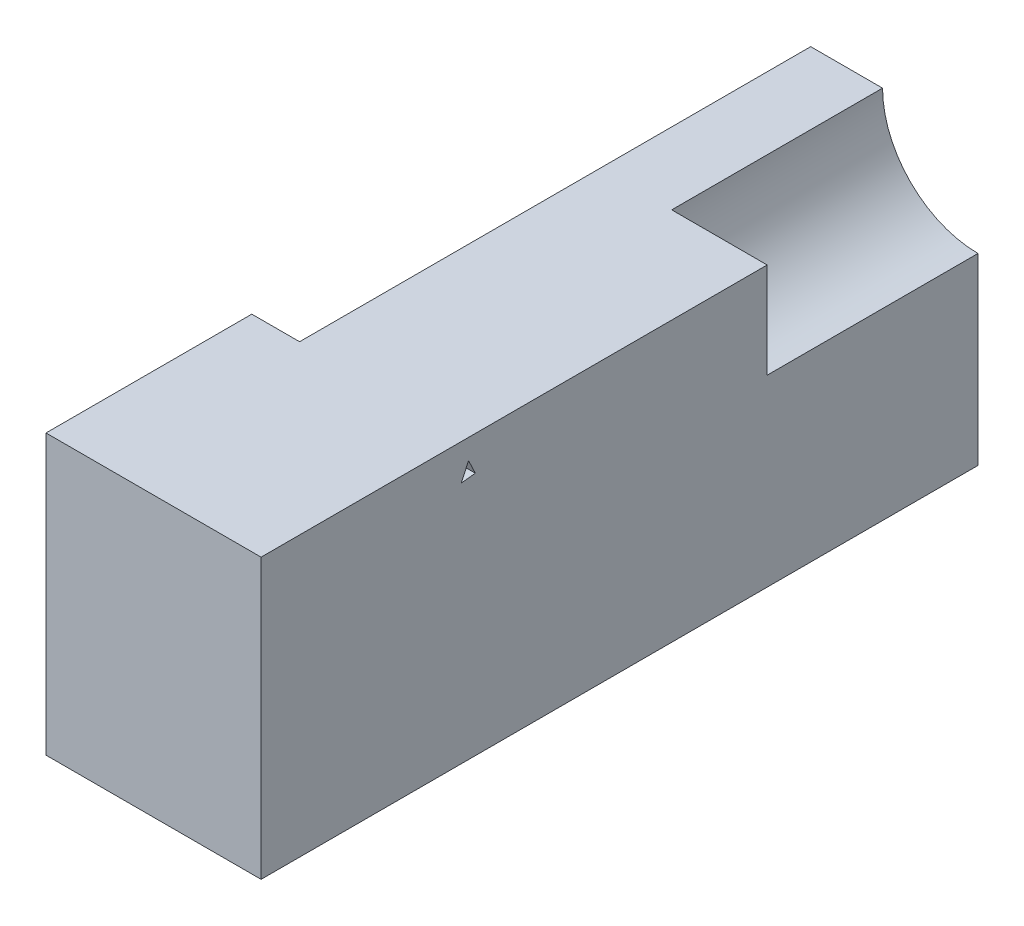
ISO-10303-21;
HEADER;
FILE_DESCRIPTION(('STEP AP214'),'2;1');
FILE_NAME('part.step','',(''),(''),'','','');
FILE_SCHEMA(('AUTOMOTIVE_DESIGN { 1 0 10303 214 1 1 1 1 }'));
ENDSEC;
DATA;
#1=APPLICATION_CONTEXT('core data for automotive mechanical design processes');
#2=APPLICATION_PROTOCOL_DEFINITION('international standard','automotive_design',2000,#1);
#3=PRODUCT_CONTEXT('',#1,'mechanical');
#4=PRODUCT('Part','Part','',(#3));
#5=PRODUCT_RELATED_PRODUCT_CATEGORY('part','',(#4));
#6=PRODUCT_DEFINITION_FORMATION('','',#4);
#7=PRODUCT_DEFINITION_CONTEXT('part definition',#1,'design');
#8=PRODUCT_DEFINITION('design','',#6,#7);
#9=PRODUCT_DEFINITION_SHAPE('','',#8);
#10=(LENGTH_UNIT() NAMED_UNIT(*) SI_UNIT(.MILLI.,.METRE.));
#11=(NAMED_UNIT(*) PLANE_ANGLE_UNIT() SI_UNIT($,.RADIAN.));
#12=(NAMED_UNIT(*) SI_UNIT($,.STERADIAN.) SOLID_ANGLE_UNIT());
#13=UNCERTAINTY_MEASURE_WITH_UNIT(LENGTH_MEASURE(1.E-05),#10,'distance_accuracy_value','');
#14=(GEOMETRIC_REPRESENTATION_CONTEXT(3) GLOBAL_UNCERTAINTY_ASSIGNED_CONTEXT((#13)) GLOBAL_UNIT_ASSIGNED_CONTEXT((#10,
#11,#12)) REPRESENTATION_CONTEXT('',''));
#15=CARTESIAN_POINT('',(0.,0.,0.));
#16=DIRECTION('',(0.,0.,1.));
#17=DIRECTION('',(1.,0.,0.));
#18=AXIS2_PLACEMENT_3D('',#15,#16,#17);
#19=CARTESIAN_POINT('',(0.,0.,0.));
#20=DIRECTION('',(1.,0.,0.));
#21=DIRECTION('',(0.,1.,0.));
#22=AXIS2_PLACEMENT_3D('',#19,#20,#21);
#23=PLANE('',#22);
#24=DIRECTION('',(0.,1.,0.));
#25=VECTOR('',#24,1.);
#26=CARTESIAN_POINT('',(0.,0.,79.892292740171));
#27=LINE('',#26,#25);
#28=CARTESIAN_POINT('',(0.,0.,79.892292740171));
#29=VERTEX_POINT('',#28);
#30=CARTESIAN_POINT('',(0.,31.098184685144,79.892292740171));
#31=VERTEX_POINT('',#30);
#32=EDGE_CURVE('E43',#29,#31,#27,.T.);
#33=ORIENTED_EDGE('',*,*,#32,.T.);
#34=DIRECTION('',(0.,0.,1.));
#35=VECTOR('',#34,1.);
#36=CARTESIAN_POINT('',(0.,31.098184685144,0.));
#37=LINE('',#36,#35);
#38=CARTESIAN_POINT('',(0.,31.098184685144,56.957119213043));
#39=VERTEX_POINT('',#38);
#40=EDGE_CURVE('E196',#39,#31,#37,.T.);
#41=ORIENTED_EDGE('',*,*,#40,.F.);
#42=DIRECTION('',(0.,1.,0.));
#43=VECTOR('',#42,1.);
#44=CARTESIAN_POINT('',(0.,0.,56.957119213043));
#45=LINE('',#44,#43);
#46=CARTESIAN_POINT('',(0.,28.454084183337,56.957119213043));
#47=VERTEX_POINT('',#46);
#48=EDGE_CURVE('E197',#47,#39,#45,.T.);
#49=ORIENTED_EDGE('',*,*,#48,.F.);
#50=DIRECTION('',(0.,-0.907754917884879,0.419500904713944));
#51=VECTOR('',#50,1.);
#52=CARTESIAN_POINT('',(0.,27.775449609147,57.270736701898));
#53=LINE('',#52,#51);
#54=CARTESIAN_POINT('',(0.,27.090633965193,57.587210649372));
#55=VERTEX_POINT('',#54);
#56=EDGE_CURVE('E304',#47,#55,#53,.T.);
#57=ORIENTED_EDGE('',*,*,#56,.T.);
#58=DIRECTION('',(0.,0.110317625824,-0.993896383650004));
#59=VECTOR('',#58,1.);
#60=CARTESIAN_POINT('',(0.,30.082842141755,30.629189539079));
#61=LINE('',#60,#59);
#62=CARTESIAN_POINT('',(0.,27.160571025485,56.957119213043));
#63=VERTEX_POINT('',#62);
#64=EDGE_CURVE('E305',#55,#63,#61,.T.);
#65=ORIENTED_EDGE('',*,*,#64,.T.);
#66=DIRECTION('',(0.,1.,0.));
#67=VECTOR('',#66,1.);
#68=CARTESIAN_POINT('',(0.,0.,56.957119213043));
#69=LINE('',#68,#67);
#70=CARTESIAN_POINT('',(0.,0.,56.957119213043));
#71=VERTEX_POINT('',#70);
#72=EDGE_CURVE('E224',#71,#63,#69,.T.);
#73=ORIENTED_EDGE('',*,*,#72,.F.);
#74=DIRECTION('',(0.,0.,1.));
#75=VECTOR('',#74,1.);
#76=CARTESIAN_POINT('',(0.,0.,0.));
#77=LINE('',#76,#75);
#78=EDGE_CURVE('E10',#71,#29,#77,.T.);
#79=ORIENTED_EDGE('',*,*,#78,.T.);
#80=EDGE_LOOP('',(#33,#41,#49,#57,#65,#73,#79));
#81=FACE_BOUND('',#80,.T.);
#82=ADVANCED_FACE('F16',(#81),#23,.F.);
#83=CARTESIAN_POINT('',(0.,0.,0.));
#84=DIRECTION('',(0.,1.,0.));
#85=DIRECTION('',(1.,0.,0.));
#86=AXIS2_PLACEMENT_3D('',#83,#84,#85);
#87=PLANE('',#86);
#88=DIRECTION('',(0.,0.,1.));
#89=VECTOR('',#88,1.);
#90=CARTESIAN_POINT('',(23.97055786755,0.,0.));
#91=LINE('',#90,#89);
#92=CARTESIAN_POINT('',(23.97055786755,0.,0.));
#93=VERTEX_POINT('',#92);
#94=CARTESIAN_POINT('',(23.97055786755,0.,79.892292740171));
#95=VERTEX_POINT('',#94);
#96=EDGE_CURVE('E281',#93,#95,#91,.T.);
#97=ORIENTED_EDGE('',*,*,#96,.T.);
#98=DIRECTION('',(1.,0.,0.));
#99=VECTOR('',#98,1.);
#100=CARTESIAN_POINT('',(0.,0.,79.892292740171));
#101=LINE('',#100,#99);
#102=EDGE_CURVE('E24',#29,#95,#101,.T.);
#103=ORIENTED_EDGE('',*,*,#102,.F.);
#104=ORIENTED_EDGE('',*,*,#78,.F.);
#105=DIRECTION('',(-1.,0.,0.));
#106=VECTOR('',#105,1.);
#107=CARTESIAN_POINT('',(5.325498064003,0.,56.957119213043));
#108=LINE('',#107,#106);
#109=CARTESIAN_POINT('',(5.325498064003,0.,56.957119213043));
#110=VERTEX_POINT('',#109);
#111=EDGE_CURVE('E229',#110,#71,#108,.T.);
#112=ORIENTED_EDGE('',*,*,#111,.F.);
#113=DIRECTION('',(0.,0.,1.));
#114=VECTOR('',#113,1.);
#115=CARTESIAN_POINT('',(5.325498064003,0.,0.));
#116=LINE('',#115,#114);
#117=CARTESIAN_POINT('',(5.325498064003,0.,0.));
#118=VERTEX_POINT('',#117);
#119=EDGE_CURVE('E244',#118,#110,#116,.T.);
#120=ORIENTED_EDGE('',*,*,#119,.F.);
#121=DIRECTION('',(1.,0.,0.));
#122=VECTOR('',#121,1.);
#123=CARTESIAN_POINT('',(0.,0.,0.));
#124=LINE('',#123,#122);
#125=EDGE_CURVE('E210',#118,#93,#124,.T.);
#126=ORIENTED_EDGE('',*,*,#125,.T.);
#127=EDGE_LOOP('',(#97,#103,#104,#112,#120,#126));
#128=FACE_BOUND('',#127,.T.);
#129=ADVANCED_FACE('F613',(#128),#87,.F.);
#130=CARTESIAN_POINT('',(0.,0.,79.892292740171));
#131=DIRECTION('',(0.,0.,1.));
#132=DIRECTION('',(1.,0.,0.));
#133=AXIS2_PLACEMENT_3D('',#130,#131,#132);
#134=PLANE('',#133);
#135=ORIENTED_EDGE('',*,*,#32,.F.);
#136=ORIENTED_EDGE('',*,*,#102,.T.);
#137=DIRECTION('',(0.,1.,0.));
#138=VECTOR('',#137,1.);
#139=CARTESIAN_POINT('',(23.97055786755,0.,79.892292740171));
#140=LINE('',#139,#138);
#141=CARTESIAN_POINT('',(23.97055786755,31.098184685144,79.892292740171));
#142=VERTEX_POINT('',#141);
#143=EDGE_CURVE('E243',#95,#142,#140,.T.);
#144=ORIENTED_EDGE('',*,*,#143,.T.);
#145=DIRECTION('',(1.,0.,0.));
#146=VECTOR('',#145,1.);
#147=CARTESIAN_POINT('',(0.,31.098184685144,79.892292740171));
#148=LINE('',#147,#146);
#149=EDGE_CURVE('E319',#31,#142,#148,.T.);
#150=ORIENTED_EDGE('',*,*,#149,.F.);
#151=EDGE_LOOP('',(#135,#136,#144,#150));
#152=FACE_BOUND('',#151,.T.);
#153=ADVANCED_FACE('F608',(#152),#134,.T.);
#154=CARTESIAN_POINT('',(0.,31.098184685144,0.));
#155=DIRECTION('',(0.,1.,0.));
#156=DIRECTION('',(1.,0.,0.));
#157=AXIS2_PLACEMENT_3D('',#154,#155,#156);
#158=PLANE('',#157);
#159=DIRECTION('',(1.,0.,0.));
#160=VECTOR('',#159,1.);
#161=CARTESIAN_POINT('',(0.,31.098184685144,0.));
#162=LINE('',#161,#160);
#163=CARTESIAN_POINT('',(5.325498064003,31.098184685144,0.));
#164=VERTEX_POINT('',#163);
#165=CARTESIAN_POINT('',(13.333664042095,31.098184685144,0.));
#166=VERTEX_POINT('',#165);
#167=EDGE_CURVE('E213',#164,#166,#162,.T.);
#168=ORIENTED_EDGE('',*,*,#167,.F.);
#169=DIRECTION('',(0.,0.,1.));
#170=VECTOR('',#169,1.);
#171=CARTESIAN_POINT('',(5.325498064003,31.098184685144,0.));
#172=LINE('',#171,#170);
#173=CARTESIAN_POINT('',(5.325498064003,31.098184685144,56.957119213043));
#174=VERTEX_POINT('',#173);
#175=EDGE_CURVE('E220',#164,#174,#172,.T.);
#176=ORIENTED_EDGE('',*,*,#175,.T.);
#177=DIRECTION('',(1.,0.,0.));
#178=VECTOR('',#177,1.);
#179=CARTESIAN_POINT('',(0.,31.098184685144,56.957119213043));
#180=LINE('',#179,#178);
#181=EDGE_CURVE('E193',#39,#174,#180,.T.);
#182=ORIENTED_EDGE('',*,*,#181,.F.);
#183=ORIENTED_EDGE('',*,*,#40,.T.);
#184=ORIENTED_EDGE('',*,*,#149,.T.);
#185=DIRECTION('',(0.,0.,1.));
#186=VECTOR('',#185,1.);
#187=CARTESIAN_POINT('',(23.97055786755,31.098184685144,0.));
#188=LINE('',#187,#186);
#189=CARTESIAN_POINT('',(23.97055786755,31.098184685144,23.496480838702));
#190=VERTEX_POINT('',#189);
#191=EDGE_CURVE('E288',#190,#142,#188,.T.);
#192=ORIENTED_EDGE('',*,*,#191,.F.);
#193=DIRECTION('',(1.,0.,0.));
#194=VECTOR('',#193,1.);
#195=CARTESIAN_POINT('',(13.333664042095,31.098184685144,23.496480838702));
#196=LINE('',#195,#194);
#197=CARTESIAN_POINT('',(13.333664042095,31.098184685144,23.496480838702));
#198=VERTEX_POINT('',#197);
#199=EDGE_CURVE('E219',#198,#190,#196,.T.);
#200=ORIENTED_EDGE('',*,*,#199,.F.);
#201=DIRECTION('',(0.,0.,1.));
#202=VECTOR('',#201,1.);
#203=CARTESIAN_POINT('',(13.333664042095,31.098184685144,0.));
#204=LINE('',#203,#202);
#205=EDGE_CURVE('E263',#166,#198,#204,.T.);
#206=ORIENTED_EDGE('',*,*,#205,.F.);
#207=EDGE_LOOP('',(#168,#176,#182,#183,#184,#192,#200,#206));
#208=FACE_BOUND('',#207,.T.);
#209=ADVANCED_FACE('F612',(#208),#158,.T.);
#210=CARTESIAN_POINT('',(2.977349733661,15.549092342572,56.957119213043));
#211=DIRECTION('',(0.,0.,-1.));
#212=DIRECTION('',(0.,-1.,0.));
#213=AXIS2_PLACEMENT_3D('',#210,#211,#212);
#214=PLANE('',#213);
#215=DIRECTION('',(1.,0.,0.));
#216=VECTOR('',#215,1.);
#217=CARTESIAN_POINT('',(13.473953800606,28.454084183337,56.957119213043));
#218=LINE('',#217,#216);
#219=CARTESIAN_POINT('',(5.571616777536,28.454084183337,56.957119213043));
#220=VERTEX_POINT('',#219);
#221=EDGE_CURVE('E316',#47,#220,#218,.T.);
#222=ORIENTED_EDGE('',*,*,#221,.F.);
#223=ORIENTED_EDGE('',*,*,#48,.T.);
#224=ORIENTED_EDGE('',*,*,#181,.T.);
#225=DIRECTION('',(0.0926815638794323,-0.995695800793025,0.));
#226=VECTOR('',#225,1.);
#227=CARTESIAN_POINT('',(5.325498064003,31.098184685144,56.957119213043));
#228=LINE('',#227,#226);
#229=EDGE_CURVE('E235',#174,#220,#228,.T.);
#230=ORIENTED_EDGE('',*,*,#229,.T.);
#231=EDGE_LOOP('',(#222,#223,#224,#230));
#232=FACE_BOUND('',#231,.T.);
#233=ADVANCED_FACE('F653',(#232),#214,.T.);
#234=CARTESIAN_POINT('',(23.97055786755,28.854021416779,56.772296164495));
#235=DIRECTION('',(0.,0.419500904713944,0.907754917884879));
#236=DIRECTION('',(1.,0.,0.));
#237=AXIS2_PLACEMENT_3D('',#234,#235,#236);
#238=PLANE('',#237);
#239=DIRECTION('',(-1.,0.,0.));
#240=VECTOR('',#239,1.);
#241=CARTESIAN_POINT('',(23.97055786755,27.090633965193,57.587210649372));
#242=LINE('',#241,#240);
#243=CARTESIAN_POINT('',(23.97055786755,27.090633965193,57.587210649372));
#244=VERTEX_POINT('',#243);
#245=EDGE_CURVE('E300',#244,#55,#242,.T.);
#246=ORIENTED_EDGE('',*,*,#245,.T.);
#247=ORIENTED_EDGE('',*,*,#56,.F.);
#248=ORIENTED_EDGE('',*,*,#221,.T.);
#249=DIRECTION('',(0.0841958069571498,-0.904531688099997,0.418011353091999));
#250=VECTOR('',#249,1.);
#251=CARTESIAN_POINT('',(4.514495579591,39.81093978293,51.708773977038));
#252=LINE('',#251,#250);
#253=CARTESIAN_POINT('',(5.534389736687,28.854021416779,56.772296164495));
#254=VERTEX_POINT('',#253);
#255=EDGE_CURVE('E180',#254,#220,#252,.T.);
#256=ORIENTED_EDGE('',*,*,#255,.F.);
#257=DIRECTION('',(-1.,0.,0.));
#258=VECTOR('',#257,1.);
#259=CARTESIAN_POINT('',(23.97055786755,28.854021416779,56.772296164495));
#260=LINE('',#259,#258);
#261=CARTESIAN_POINT('',(23.97055786755,28.854021416779,56.772296164495));
#262=VERTEX_POINT('',#261);
#263=EDGE_CURVE('E191',#262,#254,#260,.T.);
#264=ORIENTED_EDGE('',*,*,#263,.F.);
#265=DIRECTION('',(0.,-0.907754917884879,0.419500904713944));
#266=VECTOR('',#265,1.);
#267=CARTESIAN_POINT('',(23.97055786755,28.854021416779,56.772296164495));
#268=LINE('',#267,#266);
#269=EDGE_CURVE('E214',#262,#244,#268,.T.);
#270=ORIENTED_EDGE('',*,*,#269,.T.);
#271=EDGE_LOOP('',(#246,#247,#248,#256,#264,#270));
#272=FACE_BOUND('',#271,.T.);
#273=ADVANCED_FACE('F600',(#272),#238,.F.);
#274=CARTESIAN_POINT('',(23.97055786755,27.090633965193,57.587210649372));
#275=DIRECTION('',(0.,-0.993896383650004,-0.110317625824));
#276=DIRECTION('',(0.,0.110317625824,-0.993896383650004));
#277=AXIS2_PLACEMENT_3D('',#274,#275,#276);
#278=PLANE('',#277);
#279=DIRECTION('',(-1.,0.,0.));
#280=VECTOR('',#279,1.);
#281=CARTESIAN_POINT('',(23.97055786755,27.2643927361,56.021747172967));
#282=LINE('',#281,#280);
#283=CARTESIAN_POINT('',(23.97055786755,27.2643927361,56.021747172967));
#284=VERTEX_POINT('',#283);
#285=CARTESIAN_POINT('',(5.682355884577,27.2643927361,56.021747172967));
#286=VERTEX_POINT('',#285);
#287=EDGE_CURVE('E190',#284,#286,#282,.T.);
#288=ORIENTED_EDGE('',*,*,#287,.T.);
#289=DIRECTION('',(-0.0102680668798703,0.110311810101003,-0.993843987432027));
#290=VECTOR('',#289,1.);
#291=CARTESIAN_POINT('',(5.403369043141,30.261601834293,29.018670724634));
#292=LINE('',#291,#290);
#293=CARTESIAN_POINT('',(5.692019838665,27.160571025485,56.957119213043));
#294=VERTEX_POINT('',#293);
#295=EDGE_CURVE('E185',#294,#286,#292,.T.);
#296=ORIENTED_EDGE('',*,*,#295,.F.);
#297=DIRECTION('',(-1.,0.,0.));
#298=VECTOR('',#297,1.);
#299=CARTESIAN_POINT('',(13.473953800606,27.160571025485,56.957119213043));
#300=LINE('',#299,#298);
#301=EDGE_CURVE('E228',#294,#63,#300,.T.);
#302=ORIENTED_EDGE('',*,*,#301,.T.);
#303=ORIENTED_EDGE('',*,*,#64,.F.);
#304=ORIENTED_EDGE('',*,*,#245,.F.);
#305=DIRECTION('',(0.,0.110317625824,-0.993896383650004));
#306=VECTOR('',#305,1.);
#307=CARTESIAN_POINT('',(23.97055786755,27.090633965193,57.587210649372));
#308=LINE('',#307,#306);
#309=EDGE_CURVE('E292',#244,#284,#308,.T.);
#310=ORIENTED_EDGE('',*,*,#309,.T.);
#311=EDGE_LOOP('',(#288,#296,#302,#303,#304,#310));
#312=FACE_BOUND('',#311,.T.);
#313=ADVANCED_FACE('F595',(#312),#278,.F.);
#314=CARTESIAN_POINT('',(2.977349733661,15.549092342572,56.957119213043));
#315=DIRECTION('',(0.,0.,-1.));
#316=DIRECTION('',(0.,-1.,0.));
#317=AXIS2_PLACEMENT_3D('',#314,#315,#316);
#318=PLANE('',#317);
#319=CARTESIAN_POINT('',(3.429936067824,24.888626486308,56.957119213043));
#320=DIRECTION('',(0.,0.,-1.));
#321=DIRECTION('',(-1.,0.,0.));
#322=AXIS2_PLACEMENT_3D('',#319,#320,#321);
#323=CIRCLE('',#322,1.);
#324=CARTESIAN_POINT('',(2.429936067824,24.888626486308,56.957119213043));
#325=VERTEX_POINT('',#324);
#326=EDGE_CURVE('E204',#325,#325,#323,.T.);
#327=ORIENTED_EDGE('',*,*,#326,.F.);
#328=EDGE_LOOP('',(#327));
#329=FACE_BOUND('',#328,.T.);
#330=DIRECTION('',(-0.0926815638794323,-0.995695800793025,0.));
#331=VECTOR('',#330,1.);
#332=CARTESIAN_POINT('',(6.772841915476,15.549092342572,56.957119213043));
#333=LINE('',#332,#331);
#334=CARTESIAN_POINT('',(6.772841915476,15.549092342572,56.957119213043));
#335=VERTEX_POINT('',#334);
#336=EDGE_CURVE('E239',#335,#110,#333,.T.);
#337=ORIENTED_EDGE('',*,*,#336,.T.);
#338=ORIENTED_EDGE('',*,*,#111,.T.);
#339=ORIENTED_EDGE('',*,*,#72,.T.);
#340=ORIENTED_EDGE('',*,*,#301,.F.);
#341=DIRECTION('',(0.0926815638794323,-0.995695800793025,0.));
#342=VECTOR('',#341,1.);
#343=CARTESIAN_POINT('',(5.325498064003,31.098184685144,56.957119213043));
#344=LINE('',#343,#342);
#345=EDGE_CURVE('E181',#294,#335,#344,.T.);
#346=ORIENTED_EDGE('',*,*,#345,.T.);
#347=EDGE_LOOP('',(#337,#338,#339,#340,#346));
#348=FACE_BOUND('',#347,.T.);
#349=ADVANCED_FACE('F599',(#329,#348),#318,.T.);
#350=CARTESIAN_POINT('',(0.,0.,0.));
#351=DIRECTION('',(0.,0.,1.));
#352=DIRECTION('',(1.,0.,0.));
#353=AXIS2_PLACEMENT_3D('',#350,#351,#352);
#354=PLANE('',#353);
#355=CARTESIAN_POINT('',(23.97055786755,31.098184685144,0.));
#356=DIRECTION('',(0.,0.,-1.));
#357=DIRECTION('',(-1.,0.,0.));
#358=AXIS2_PLACEMENT_3D('',#355,#356,#357);
#359=CIRCLE('',#358,10.636893825455);
#360=CARTESIAN_POINT('',(23.97055786755,20.461290859689,0.));
#361=VERTEX_POINT('',#360);
#362=EDGE_CURVE('E259',#361,#166,#359,.T.);
#363=ORIENTED_EDGE('',*,*,#362,.F.);
#364=DIRECTION('',(0.,1.,0.));
#365=VECTOR('',#364,1.);
#366=CARTESIAN_POINT('',(23.97055786755,0.,0.));
#367=LINE('',#366,#365);
#368=EDGE_CURVE('E285',#93,#361,#367,.T.);
#369=ORIENTED_EDGE('',*,*,#368,.F.);
#370=ORIENTED_EDGE('',*,*,#125,.F.);
#371=DIRECTION('',(-0.0926815638794323,-0.995695800793025,0.));
#372=VECTOR('',#371,1.);
#373=CARTESIAN_POINT('',(6.772841915476,15.549092342572,0.));
#374=LINE('',#373,#372);
#375=CARTESIAN_POINT('',(6.772841915476,15.549092342572,0.));
#376=VERTEX_POINT('',#375);
#377=EDGE_CURVE('E269',#376,#118,#374,.T.);
#378=ORIENTED_EDGE('',*,*,#377,.F.);
#379=DIRECTION('',(0.0926815638794323,-0.995695800793025,0.));
#380=VECTOR('',#379,1.);
#381=CARTESIAN_POINT('',(5.325498064003,31.098184685144,0.));
#382=LINE('',#381,#380);
#383=EDGE_CURVE('E215',#164,#376,#382,.T.);
#384=ORIENTED_EDGE('',*,*,#383,.F.);
#385=ORIENTED_EDGE('',*,*,#167,.T.);
#386=EDGE_LOOP('',(#363,#369,#370,#378,#384,#385));
#387=FACE_BOUND('',#386,.T.);
#388=ADVANCED_FACE('F685',(#387),#354,.F.);
#389=CARTESIAN_POINT('',(23.97055786755,0.,0.));
#390=DIRECTION('',(1.,0.,0.));
#391=DIRECTION('',(0.,1.,0.));
#392=AXIS2_PLACEMENT_3D('',#389,#390,#391);
#393=PLANE('',#392);
#394=ORIENTED_EDGE('',*,*,#309,.F.);
#395=ORIENTED_EDGE('',*,*,#269,.F.);
#396=DIRECTION('',(0.,0.904272586125178,0.426955606571084));
#397=VECTOR('',#396,1.);
#398=CARTESIAN_POINT('',(23.97055786755,27.2643927361,56.021747172967));
#399=LINE('',#398,#397);
#400=EDGE_CURVE('E201',#284,#262,#399,.T.);
#401=ORIENTED_EDGE('',*,*,#400,.F.);
#402=EDGE_LOOP('',(#394,#395,#401));
#403=FACE_BOUND('',#402,.T.);
#404=ORIENTED_EDGE('',*,*,#143,.F.);
#405=ORIENTED_EDGE('',*,*,#96,.F.);
#406=ORIENTED_EDGE('',*,*,#368,.T.);
#407=DIRECTION('',(0.,0.,1.));
#408=VECTOR('',#407,1.);
#409=CARTESIAN_POINT('',(23.97055786755,20.461290859689,0.));
#410=LINE('',#409,#408);
#411=CARTESIAN_POINT('',(23.97055786755,20.461290859689,23.496480838702));
#412=VERTEX_POINT('',#411);
#413=EDGE_CURVE('E266',#361,#412,#410,.T.);
#414=ORIENTED_EDGE('',*,*,#413,.T.);
#415=DIRECTION('',(0.,-1.,0.));
#416=VECTOR('',#415,1.);
#417=CARTESIAN_POINT('',(23.97055786755,31.098184685144,23.496480838702));
#418=LINE('',#417,#416);
#419=EDGE_CURVE('E251',#190,#412,#418,.T.);
#420=ORIENTED_EDGE('',*,*,#419,.F.);
#421=ORIENTED_EDGE('',*,*,#191,.T.);
#422=EDGE_LOOP('',(#404,#405,#406,#414,#420,#421));
#423=FACE_BOUND('',#422,.T.);
#424=ADVANCED_FACE('F689',(#403,#423),#393,.T.);
#425=CARTESIAN_POINT('',(6.772841915476,15.549092342572,0.));
#426=DIRECTION('',(0.995695800793025,-0.0926815638794323,0.));
#427=DIRECTION('',(0.,0.,-1.));
#428=AXIS2_PLACEMENT_3D('',#425,#426,#427);
#429=PLANE('',#428);
#430=ORIENTED_EDGE('',*,*,#377,.T.);
#431=ORIENTED_EDGE('',*,*,#119,.T.);
#432=ORIENTED_EDGE('',*,*,#336,.F.);
#433=DIRECTION('',(0.,0.,1.));
#434=VECTOR('',#433,1.);
#435=CARTESIAN_POINT('',(6.772841915476,15.549092342572,0.));
#436=LINE('',#435,#434);
#437=EDGE_CURVE('E186',#376,#335,#436,.T.);
#438=ORIENTED_EDGE('',*,*,#437,.F.);
#439=EDGE_LOOP('',(#430,#431,#432,#438));
#440=FACE_BOUND('',#439,.T.);
#441=ADVANCED_FACE('F677',(#440),#429,.F.);
#442=CARTESIAN_POINT('',(23.97055786755,31.098184685144,0.));
#443=DIRECTION('',(0.,0.,-1.));
#444=DIRECTION('',(-1.,0.,0.));
#445=AXIS2_PLACEMENT_3D('',#442,#443,#444);
#446=CYLINDRICAL_SURFACE('',#445,10.636893825455);
#447=ORIENTED_EDGE('',*,*,#362,.T.);
#448=ORIENTED_EDGE('',*,*,#205,.T.);
#449=CARTESIAN_POINT('',(23.97055786755,31.098184685144,23.496480838702));
#450=DIRECTION('',(0.,0.,-1.));
#451=DIRECTION('',(-1.,0.,0.));
#452=AXIS2_PLACEMENT_3D('',#449,#450,#451);
#453=CIRCLE('',#452,10.636893825455);
#454=EDGE_CURVE('E255',#412,#198,#453,.T.);
#455=ORIENTED_EDGE('',*,*,#454,.F.);
#456=ORIENTED_EDGE('',*,*,#413,.F.);
#457=EDGE_LOOP('',(#447,#448,#455,#456));
#458=FACE_BOUND('',#457,.T.);
#459=ADVANCED_FACE('F576',(#458),#446,.F.);
#460=CARTESIAN_POINT('',(19.581795239869,26.709422057463,23.496480838702));
#461=DIRECTION('',(0.,0.,-1.));
#462=DIRECTION('',(0.,-1.,0.));
#463=AXIS2_PLACEMENT_3D('',#460,#461,#462);
#464=PLANE('',#463);
#465=ORIENTED_EDGE('',*,*,#199,.T.);
#466=ORIENTED_EDGE('',*,*,#419,.T.);
#467=ORIENTED_EDGE('',*,*,#454,.T.);
#468=EDGE_LOOP('',(#465,#466,#467));
#469=FACE_BOUND('',#468,.T.);
#470=ADVANCED_FACE('F571',(#469),#464,.T.);
#471=CARTESIAN_POINT('',(5.325498064003,31.098184685144,0.));
#472=DIRECTION('',(0.995695800793025,0.0926815638794323,0.));
#473=DIRECTION('',(0.,0.,-1.));
#474=AXIS2_PLACEMENT_3D('',#471,#472,#473);
#475=PLANE('',#474);
#476=ORIENTED_EDGE('',*,*,#437,.T.);
#477=ORIENTED_EDGE('',*,*,#345,.F.);
#478=ORIENTED_EDGE('',*,*,#295,.T.);
#479=DIRECTION('',(-0.0838750913893989,0.901086179298418,0.425451132942197));
#480=VECTOR('',#479,1.);
#481=CARTESIAN_POINT('',(6.600114282592,17.404738401442,51.366475342735));
#482=LINE('',#481,#480);
#483=EDGE_CURVE('E187',#286,#254,#482,.T.);
#484=ORIENTED_EDGE('',*,*,#483,.T.);
#485=ORIENTED_EDGE('',*,*,#255,.T.);
#486=ORIENTED_EDGE('',*,*,#229,.F.);
#487=ORIENTED_EDGE('',*,*,#175,.F.);
#488=ORIENTED_EDGE('',*,*,#383,.T.);
#489=EDGE_LOOP('',(#476,#477,#478,#484,#485,#486,#487,#488));
#490=FACE_BOUND('',#489,.T.);
#491=ADVANCED_FACE('F575',(#490),#475,.F.);
#492=CARTESIAN_POINT('',(23.97055786755,27.2643927361,56.021747172967));
#493=DIRECTION('',(0.,0.426955606571084,-0.904272586125178));
#494=DIRECTION('',(-1.,0.,0.));
#495=AXIS2_PLACEMENT_3D('',#492,#493,#494);
#496=PLANE('',#495);
#497=ORIENTED_EDGE('',*,*,#263,.T.);
#498=ORIENTED_EDGE('',*,*,#483,.F.);
#499=ORIENTED_EDGE('',*,*,#287,.F.);
#500=ORIENTED_EDGE('',*,*,#400,.T.);
#501=EDGE_LOOP('',(#497,#498,#499,#500));
#502=FACE_BOUND('',#501,.T.);
#503=ADVANCED_FACE('F635',(#502),#496,.F.);
#504=CARTESIAN_POINT('',(3.429936067824,24.888626486308,56.957119213043));
#505=DIRECTION('',(0.,0.,-1.));
#506=DIRECTION('',(-1.,0.,0.));
#507=AXIS2_PLACEMENT_3D('',#504,#505,#506);
#508=CYLINDRICAL_SURFACE('',#507,1.);
#509=CARTESIAN_POINT('',(3.429936067824,24.888626486308,71.117280244872));
#510=DIRECTION('',(0.,0.,-1.));
#511=DIRECTION('',(-1.,0.,0.));
#512=AXIS2_PLACEMENT_3D('',#509,#510,#511);
#513=CIRCLE('',#512,1.);
#514=CARTESIAN_POINT('',(2.429936067824,24.888626486308,71.117280244872));
#515=VERTEX_POINT('',#514);
#516=EDGE_CURVE('E176',#515,#515,#513,.T.);
#517=ORIENTED_EDGE('',*,*,#516,.F.);
#518=EDGE_LOOP('',(#517));
#519=FACE_BOUND('',#518,.T.);
#520=ORIENTED_EDGE('',*,*,#326,.T.);
#521=EDGE_LOOP('',(#520));
#522=FACE_BOUND('',#521,.T.);
#523=ADVANCED_FACE('F624',(#519,#522),#508,.F.);
#524=CARTESIAN_POINT('',(3.429936067824,24.888626486308,71.117280244872));
#525=DIRECTION('',(0.,0.,-1.));
#526=DIRECTION('',(0.,-1.,0.));
#527=AXIS2_PLACEMENT_3D('',#524,#525,#526);
#528=PLANE('',#527);
#529=CARTESIAN_POINT('',(3.429936067824,24.888626486308,71.117280244872));
#530=DIRECTION('',(0.,0.,1.));
#531=DIRECTION('',(1.,0.,0.));
#532=AXIS2_PLACEMENT_3D('',#529,#530,#531);
#533=CIRCLE('',#532,0.500839069883);
#534=CARTESIAN_POINT('',(3.930775137707,24.888626486308,71.117280244872));
#535=VERTEX_POINT('',#534);
#536=EDGE_CURVE('E170',#535,#535,#533,.T.);
#537=ORIENTED_EDGE('',*,*,#536,.T.);
#538=EDGE_LOOP('',(#537));
#539=FACE_BOUND('',#538,.T.);
#540=ORIENTED_EDGE('',*,*,#516,.T.);
#541=EDGE_LOOP('',(#540));
#542=FACE_BOUND('',#541,.T.);
#543=ADVANCED_FACE('F587',(#539,#542),#528,.T.);
#544=CARTESIAN_POINT('',(3.429936067824,24.888626486308,56.957119213043));
#545=DIRECTION('',(0.,0.,-1.));
#546=DIRECTION('',(1.,0.,0.));
#547=AXIS2_PLACEMENT_3D('',#544,#545,#546);
#548=CYLINDRICAL_SURFACE('',#547,0.500839069883);
#549=ORIENTED_EDGE('',*,*,#536,.F.);
#550=EDGE_LOOP('',(#549));
#551=FACE_BOUND('',#550,.T.);
#552=CARTESIAN_POINT('',(3.429936067824,24.888626486308,56.957119213043));
#553=DIRECTION('',(0.,0.,1.));
#554=DIRECTION('',(1.,0.,0.));
#555=AXIS2_PLACEMENT_3D('',#552,#553,#554);
#556=CIRCLE('',#555,0.500839069883);
#557=CARTESIAN_POINT('',(3.930775137707,24.888626486308,56.957119213043));
#558=VERTEX_POINT('',#557);
#559=EDGE_CURVE('E166',#558,#558,#556,.T.);
#560=ORIENTED_EDGE('',*,*,#559,.T.);
#561=EDGE_LOOP('',(#560));
#562=FACE_BOUND('',#561,.T.);
#563=ADVANCED_FACE('F167',(#551,#562),#548,.T.);
#564=CARTESIAN_POINT('',(2.977349733661,15.549092342572,56.957119213043));
#565=DIRECTION('',(0.,0.,-1.));
#566=DIRECTION('',(0.,-1.,0.));
#567=AXIS2_PLACEMENT_3D('',#564,#565,#566);
#568=PLANE('',#567);
#569=ORIENTED_EDGE('',*,*,#559,.F.);
#570=EDGE_LOOP('',(#569));
#571=FACE_BOUND('',#570,.T.);
#572=ADVANCED_FACE('F560',(#571),#568,.T.);
#573=CLOSED_SHELL('',(#82,#129,#153,#209,#233,#273,#313,#349,#388,#424,#441,#459,#470,#491,#503,
#523,#543,#563,#572));
#574=MANIFOLD_SOLID_BREP('B1',#573);
#575=ADVANCED_BREP_SHAPE_REPRESENTATION('',(#18,#574),#14);
#576=SHAPE_DEFINITION_REPRESENTATION(#9,#575);
ENDSEC;
END-ISO-10303-21;
